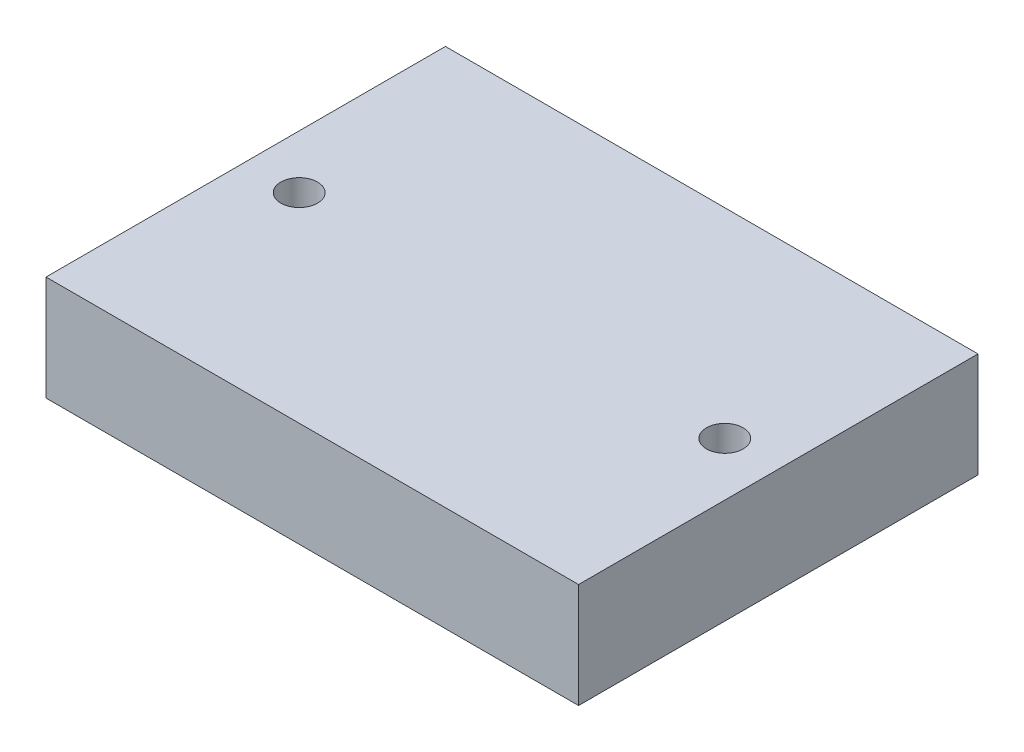
ISO-10303-21;
HEADER;
FILE_DESCRIPTION(('STEP AP214'),'2;1');
FILE_NAME('part.step','',(''),(''),'','','');
FILE_SCHEMA(('AUTOMOTIVE_DESIGN { 1 0 10303 214 1 1 1 1 }'));
ENDSEC;
DATA;
#1=APPLICATION_CONTEXT('core data for automotive mechanical design processes');
#2=APPLICATION_PROTOCOL_DEFINITION('international standard','automotive_design',2000,#1);
#3=PRODUCT_CONTEXT('',#1,'mechanical');
#4=PRODUCT('Part','Part','',(#3));
#5=PRODUCT_RELATED_PRODUCT_CATEGORY('part','',(#4));
#6=PRODUCT_DEFINITION_FORMATION('','',#4);
#7=PRODUCT_DEFINITION_CONTEXT('part definition',#1,'design');
#8=PRODUCT_DEFINITION('design','',#6,#7);
#9=PRODUCT_DEFINITION_SHAPE('','',#8);
#10=(LENGTH_UNIT() NAMED_UNIT(*) SI_UNIT(.MILLI.,.METRE.));
#11=(NAMED_UNIT(*) PLANE_ANGLE_UNIT() SI_UNIT($,.RADIAN.));
#12=(NAMED_UNIT(*) SI_UNIT($,.STERADIAN.) SOLID_ANGLE_UNIT());
#13=UNCERTAINTY_MEASURE_WITH_UNIT(LENGTH_MEASURE(1.E-05),#10,'distance_accuracy_value','');
#14=(GEOMETRIC_REPRESENTATION_CONTEXT(3) GLOBAL_UNCERTAINTY_ASSIGNED_CONTEXT((#13)) GLOBAL_UNIT_ASSIGNED_CONTEXT((#10,
#11,#12)) REPRESENTATION_CONTEXT('',''));
#15=CARTESIAN_POINT('',(0.,0.,0.));
#16=DIRECTION('',(0.,0.,1.));
#17=DIRECTION('',(1.,0.,0.));
#18=AXIS2_PLACEMENT_3D('',#15,#16,#17);
#19=CARTESIAN_POINT('',(0.,10.,0.));
#20=DIRECTION('',(0.,-1.,0.));
#21=DIRECTION('',(0.,0.,-1.));
#22=AXIS2_PLACEMENT_3D('',#19,#20,#21);
#23=PLANE('',#22);
#24=DIRECTION('',(0.,0.,1.));
#25=VECTOR('',#24,1.);
#26=CARTESIAN_POINT('',(0.,10.,0.));
#27=LINE('',#26,#25);
#28=CARTESIAN_POINT('',(0.,10.,-38.1));
#29=VERTEX_POINT('',#28);
#30=CARTESIAN_POINT('',(0.,10.,0.));
#31=VERTEX_POINT('',#30);
#32=EDGE_CURVE('E91',#29,#31,#27,.T.);
#33=ORIENTED_EDGE('',*,*,#32,.T.);
#34=DIRECTION('',(1.,0.,0.));
#35=VECTOR('',#34,1.);
#36=CARTESIAN_POINT('',(0.,10.,0.));
#37=LINE('',#36,#35);
#38=CARTESIAN_POINT('',(50.8,10.,0.));
#39=VERTEX_POINT('',#38);
#40=EDGE_CURVE('E86',#31,#39,#37,.T.);
#41=ORIENTED_EDGE('',*,*,#40,.T.);
#42=DIRECTION('',(0.,0.,-1.));
#43=VECTOR('',#42,1.);
#44=CARTESIAN_POINT('',(50.8,10.,0.));
#45=LINE('',#44,#43);
#46=CARTESIAN_POINT('',(50.8,10.,-38.1));
#47=VERTEX_POINT('',#46);
#48=EDGE_CURVE('E89',#39,#47,#45,.T.);
#49=ORIENTED_EDGE('',*,*,#48,.T.);
#50=DIRECTION('',(-1.,0.,0.));
#51=VECTOR('',#50,1.);
#52=CARTESIAN_POINT('',(0.,10.,-38.1));
#53=LINE('',#52,#51);
#54=EDGE_CURVE('E56',#47,#29,#53,.T.);
#55=ORIENTED_EDGE('',*,*,#54,.T.);
#56=EDGE_LOOP('',(#33,#41,#49,#55));
#57=FACE_BOUND('',#56,.T.);
#58=CARTESIAN_POINT('',(5.1,10.,-19.05));
#59=DIRECTION('',(0.,1.,0.));
#60=DIRECTION('',(0.,0.,1.));
#61=AXIS2_PLACEMENT_3D('',#58,#59,#60);
#62=CIRCLE('',#61,1.75);
#63=CARTESIAN_POINT('',(5.1,10.,-17.3));
#64=VERTEX_POINT('',#63);
#65=EDGE_CURVE('E111',#64,#64,#62,.T.);
#66=ORIENTED_EDGE('',*,*,#65,.F.);
#67=EDGE_LOOP('',(#66));
#68=FACE_BOUND('',#67,.T.);
#69=CARTESIAN_POINT('',(45.7,10.,-19.05));
#70=DIRECTION('',(0.,1.,0.));
#71=DIRECTION('',(0.,0.,1.));
#72=AXIS2_PLACEMENT_3D('',#69,#70,#71);
#73=CIRCLE('',#72,1.75);
#74=CARTESIAN_POINT('',(45.7,10.,-17.3));
#75=VERTEX_POINT('',#74);
#76=EDGE_CURVE('E133',#75,#75,#73,.T.);
#77=ORIENTED_EDGE('',*,*,#76,.F.);
#78=EDGE_LOOP('',(#77));
#79=FACE_BOUND('',#78,.T.);
#80=ADVANCED_FACE('F38',(#57,#68,#79),#23,.F.);
#81=CARTESIAN_POINT('',(0.,0.,0.));
#82=DIRECTION('',(0.,-1.,0.));
#83=DIRECTION('',(0.,0.,-1.));
#84=AXIS2_PLACEMENT_3D('',#81,#82,#83);
#85=PLANE('',#84);
#86=CARTESIAN_POINT('',(5.1,0.,-19.05));
#87=DIRECTION('',(0.,1.,0.));
#88=DIRECTION('',(0.,0.,1.));
#89=AXIS2_PLACEMENT_3D('',#86,#87,#88);
#90=CIRCLE('',#89,1.75);
#91=CARTESIAN_POINT('',(5.1,0.,-17.3));
#92=VERTEX_POINT('',#91);
#93=EDGE_CURVE('E129',#92,#92,#90,.T.);
#94=ORIENTED_EDGE('',*,*,#93,.T.);
#95=EDGE_LOOP('',(#94));
#96=FACE_BOUND('',#95,.T.);
#97=DIRECTION('',(0.,0.,1.));
#98=VECTOR('',#97,1.);
#99=CARTESIAN_POINT('',(0.,0.,0.));
#100=LINE('',#99,#98);
#101=CARTESIAN_POINT('',(0.,0.,-38.1));
#102=VERTEX_POINT('',#101);
#103=CARTESIAN_POINT('',(0.,0.,0.));
#104=VERTEX_POINT('',#103);
#105=EDGE_CURVE('E107',#102,#104,#100,.T.);
#106=ORIENTED_EDGE('',*,*,#105,.F.);
#107=DIRECTION('',(-1.,0.,0.));
#108=VECTOR('',#107,1.);
#109=CARTESIAN_POINT('',(0.,0.,-38.1));
#110=LINE('',#109,#108);
#111=CARTESIAN_POINT('',(50.8,0.,-38.1));
#112=VERTEX_POINT('',#111);
#113=EDGE_CURVE('E79',#112,#102,#110,.T.);
#114=ORIENTED_EDGE('',*,*,#113,.F.);
#115=DIRECTION('',(0.,0.,-1.));
#116=VECTOR('',#115,1.);
#117=CARTESIAN_POINT('',(50.8,0.,0.));
#118=LINE('',#117,#116);
#119=CARTESIAN_POINT('',(50.8,0.,0.));
#120=VERTEX_POINT('',#119);
#121=EDGE_CURVE('E73',#120,#112,#118,.T.);
#122=ORIENTED_EDGE('',*,*,#121,.F.);
#123=DIRECTION('',(1.,0.,0.));
#124=VECTOR('',#123,1.);
#125=CARTESIAN_POINT('',(0.,0.,0.));
#126=LINE('',#125,#124);
#127=EDGE_CURVE('E96',#104,#120,#126,.T.);
#128=ORIENTED_EDGE('',*,*,#127,.F.);
#129=EDGE_LOOP('',(#106,#114,#122,#128));
#130=FACE_BOUND('',#129,.T.);
#131=CARTESIAN_POINT('',(45.7,0.,-19.05));
#132=DIRECTION('',(0.,1.,0.));
#133=DIRECTION('',(0.,0.,1.));
#134=AXIS2_PLACEMENT_3D('',#131,#132,#133);
#135=CIRCLE('',#134,1.75);
#136=CARTESIAN_POINT('',(45.7,0.,-17.3));
#137=VERTEX_POINT('',#136);
#138=EDGE_CURVE('E137',#137,#137,#135,.T.);
#139=ORIENTED_EDGE('',*,*,#138,.T.);
#140=EDGE_LOOP('',(#139));
#141=FACE_BOUND('',#140,.T.);
#142=ADVANCED_FACE('F124',(#96,#130,#141),#85,.T.);
#143=CARTESIAN_POINT('',(0.,10.,0.));
#144=DIRECTION('',(1.,0.,0.));
#145=DIRECTION('',(0.,0.,-1.));
#146=AXIS2_PLACEMENT_3D('',#143,#144,#145);
#147=PLANE('',#146);
#148=ORIENTED_EDGE('',*,*,#105,.T.);
#149=DIRECTION('',(0.,-1.,0.));
#150=VECTOR('',#149,1.);
#151=CARTESIAN_POINT('',(0.,10.,0.));
#152=LINE('',#151,#150);
#153=EDGE_CURVE('E11',#31,#104,#152,.T.);
#154=ORIENTED_EDGE('',*,*,#153,.F.);
#155=ORIENTED_EDGE('',*,*,#32,.F.);
#156=DIRECTION('',(0.,-1.,0.));
#157=VECTOR('',#156,1.);
#158=CARTESIAN_POINT('',(0.,10.,-38.1));
#159=LINE('',#158,#157);
#160=EDGE_CURVE('E103',#29,#102,#159,.T.);
#161=ORIENTED_EDGE('',*,*,#160,.T.);
#162=EDGE_LOOP('',(#148,#154,#155,#161));
#163=FACE_BOUND('',#162,.T.);
#164=ADVANCED_FACE('F40',(#163),#147,.F.);
#165=CARTESIAN_POINT('',(0.,10.,0.));
#166=DIRECTION('',(0.,0.,-1.));
#167=DIRECTION('',(-1.,0.,0.));
#168=AXIS2_PLACEMENT_3D('',#165,#166,#167);
#169=PLANE('',#168);
#170=ORIENTED_EDGE('',*,*,#127,.T.);
#171=DIRECTION('',(0.,-1.,0.));
#172=VECTOR('',#171,1.);
#173=CARTESIAN_POINT('',(50.8,10.,0.));
#174=LINE('',#173,#172);
#175=EDGE_CURVE('E48',#39,#120,#174,.T.);
#176=ORIENTED_EDGE('',*,*,#175,.F.);
#177=ORIENTED_EDGE('',*,*,#40,.F.);
#178=ORIENTED_EDGE('',*,*,#153,.T.);
#179=EDGE_LOOP('',(#170,#176,#177,#178));
#180=FACE_BOUND('',#179,.T.);
#181=ADVANCED_FACE('F95',(#180),#169,.F.);
#182=CARTESIAN_POINT('',(50.8,10.,0.));
#183=DIRECTION('',(-1.,0.,0.));
#184=DIRECTION('',(0.,0.,1.));
#185=AXIS2_PLACEMENT_3D('',#182,#183,#184);
#186=PLANE('',#185);
#187=ORIENTED_EDGE('',*,*,#121,.T.);
#188=DIRECTION('',(0.,-1.,0.));
#189=VECTOR('',#188,1.);
#190=CARTESIAN_POINT('',(50.8,10.,-38.1));
#191=LINE('',#190,#189);
#192=EDGE_CURVE('E98',#47,#112,#191,.T.);
#193=ORIENTED_EDGE('',*,*,#192,.F.);
#194=ORIENTED_EDGE('',*,*,#48,.F.);
#195=ORIENTED_EDGE('',*,*,#175,.T.);
#196=EDGE_LOOP('',(#187,#193,#194,#195));
#197=FACE_BOUND('',#196,.T.);
#198=ADVANCED_FACE('F99',(#197),#186,.F.);
#199=CARTESIAN_POINT('',(0.,10.,-38.1));
#200=DIRECTION('',(0.,0.,1.));
#201=DIRECTION('',(1.,0.,0.));
#202=AXIS2_PLACEMENT_3D('',#199,#200,#201);
#203=PLANE('',#202);
#204=ORIENTED_EDGE('',*,*,#113,.T.);
#205=ORIENTED_EDGE('',*,*,#160,.F.);
#206=ORIENTED_EDGE('',*,*,#54,.F.);
#207=ORIENTED_EDGE('',*,*,#192,.T.);
#208=EDGE_LOOP('',(#204,#205,#206,#207));
#209=FACE_BOUND('',#208,.T.);
#210=ADVANCED_FACE('F121',(#209),#203,.F.);
#211=CARTESIAN_POINT('',(5.1,10.,-19.05));
#212=DIRECTION('',(0.,-1.,0.));
#213=DIRECTION('',(0.,0.,-1.));
#214=AXIS2_PLACEMENT_3D('',#211,#212,#213);
#215=CYLINDRICAL_SURFACE('',#214,1.75);
#216=ORIENTED_EDGE('',*,*,#65,.T.);
#217=EDGE_LOOP('',(#216));
#218=FACE_BOUND('',#217,.T.);
#219=ORIENTED_EDGE('',*,*,#93,.F.);
#220=EDGE_LOOP('',(#219));
#221=FACE_BOUND('',#220,.T.);
#222=ADVANCED_FACE('F156',(#218,#221),#215,.F.);
#223=CARTESIAN_POINT('',(45.7,10.,-19.05));
#224=DIRECTION('',(0.,-1.,0.));
#225=DIRECTION('',(0.,0.,-1.));
#226=AXIS2_PLACEMENT_3D('',#223,#224,#225);
#227=CYLINDRICAL_SURFACE('',#226,1.75);
#228=ORIENTED_EDGE('',*,*,#76,.T.);
#229=EDGE_LOOP('',(#228));
#230=FACE_BOUND('',#229,.T.);
#231=ORIENTED_EDGE('',*,*,#138,.F.);
#232=EDGE_LOOP('',(#231));
#233=FACE_BOUND('',#232,.T.);
#234=ADVANCED_FACE('F145',(#230,#233),#227,.F.);
#235=CLOSED_SHELL('',(#80,#142,#164,#181,#198,#210,#222,#234));
#236=MANIFOLD_SOLID_BREP('B2',#235);
#237=ADVANCED_BREP_SHAPE_REPRESENTATION('',(#18,#236),#14);
#238=SHAPE_DEFINITION_REPRESENTATION(#9,#237);
ENDSEC;
END-ISO-10303-21;
